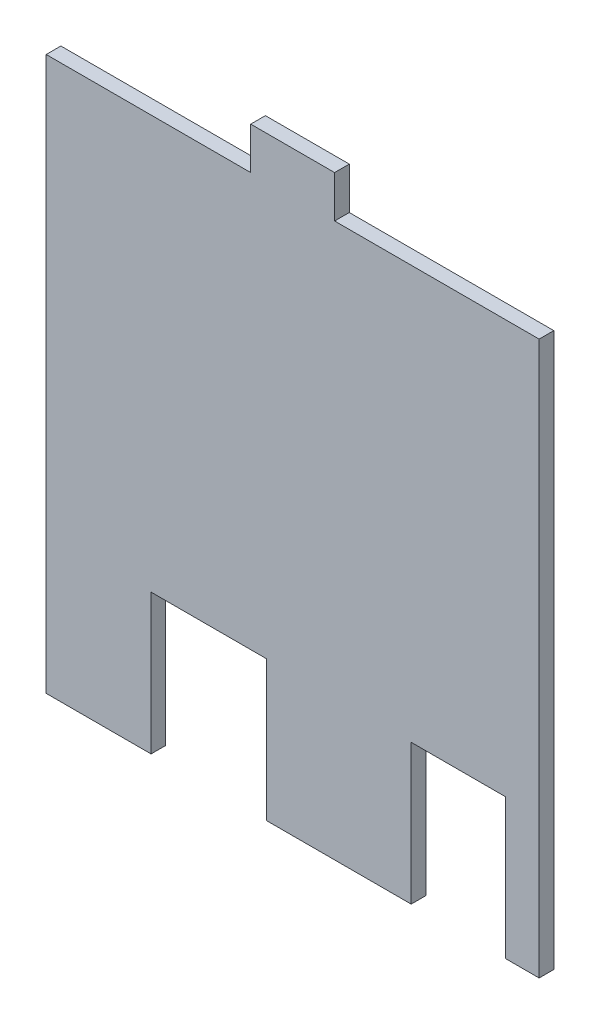
ISO-10303-21;
HEADER;
FILE_DESCRIPTION(('STEP AP214'),'2;1');
FILE_NAME('part.step','',(''),(''),'','','');
FILE_SCHEMA(('AUTOMOTIVE_DESIGN { 1 0 10303 214 1 1 1 1 }'));
ENDSEC;
DATA;
#1=APPLICATION_CONTEXT('core data for automotive mechanical design processes');
#2=APPLICATION_PROTOCOL_DEFINITION('international standard','automotive_design',2000,#1);
#3=PRODUCT_CONTEXT('',#1,'mechanical');
#4=PRODUCT('Part','Part','',(#3));
#5=PRODUCT_RELATED_PRODUCT_CATEGORY('part','',(#4));
#6=PRODUCT_DEFINITION_FORMATION('','',#4);
#7=PRODUCT_DEFINITION_CONTEXT('part definition',#1,'design');
#8=PRODUCT_DEFINITION('design','',#6,#7);
#9=PRODUCT_DEFINITION_SHAPE('','',#8);
#10=(LENGTH_UNIT() NAMED_UNIT(*) SI_UNIT(.MILLI.,.METRE.));
#11=(NAMED_UNIT(*) PLANE_ANGLE_UNIT() SI_UNIT($,.RADIAN.));
#12=(NAMED_UNIT(*) SI_UNIT($,.STERADIAN.) SOLID_ANGLE_UNIT());
#13=UNCERTAINTY_MEASURE_WITH_UNIT(LENGTH_MEASURE(1.E-05),#10,'distance_accuracy_value','');
#14=(GEOMETRIC_REPRESENTATION_CONTEXT(3) GLOBAL_UNCERTAINTY_ASSIGNED_CONTEXT((#13)) GLOBAL_UNIT_ASSIGNED_CONTEXT((#10,
#11,#12)) REPRESENTATION_CONTEXT('',''));
#15=CARTESIAN_POINT('',(0.,0.,0.));
#16=DIRECTION('',(0.,0.,1.));
#17=DIRECTION('',(1.,0.,0.));
#18=AXIS2_PLACEMENT_3D('',#15,#16,#17);
#19=CARTESIAN_POINT('',(29.845,-33.5,1.778));
#20=DIRECTION('',(-1.,0.,0.));
#21=DIRECTION('',(0.,0.,1.));
#22=AXIS2_PLACEMENT_3D('',#19,#20,#21);
#23=PLANE('',#22);
#24=DIRECTION('',(0.,1.,0.));
#25=VECTOR('',#24,1.);
#26=CARTESIAN_POINT('',(29.845,-33.5,0.));
#27=LINE('',#26,#25);
#28=CARTESIAN_POINT('',(29.845,-33.5,0.));
#29=VERTEX_POINT('',#28);
#30=CARTESIAN_POINT('',(29.845,33.5,0.));
#31=VERTEX_POINT('',#30);
#32=EDGE_CURVE('E178',#29,#31,#27,.T.);
#33=ORIENTED_EDGE('',*,*,#32,.T.);
#34=DIRECTION('',(0.,0.,-1.));
#35=VECTOR('',#34,1.);
#36=CARTESIAN_POINT('',(29.845,33.5,1.778));
#37=LINE('',#36,#35);
#38=CARTESIAN_POINT('',(29.845,33.5,1.778));
#39=VERTEX_POINT('',#38);
#40=EDGE_CURVE('E11',#39,#31,#37,.T.);
#41=ORIENTED_EDGE('',*,*,#40,.F.);
#42=DIRECTION('',(0.,1.,0.));
#43=VECTOR('',#42,1.);
#44=CARTESIAN_POINT('',(29.845,-33.5,1.778));
#45=LINE('',#44,#43);
#46=CARTESIAN_POINT('',(29.845,-33.5,1.778));
#47=VERTEX_POINT('',#46);
#48=EDGE_CURVE('E208',#47,#39,#45,.T.);
#49=ORIENTED_EDGE('',*,*,#48,.F.);
#50=DIRECTION('',(0.,0.,-1.));
#51=VECTOR('',#50,1.);
#52=CARTESIAN_POINT('',(29.845,-33.5,1.778));
#53=LINE('',#52,#51);
#54=EDGE_CURVE('E174',#47,#29,#53,.T.);
#55=ORIENTED_EDGE('',*,*,#54,.T.);
#56=EDGE_LOOP('',(#33,#41,#49,#55));
#57=FACE_BOUND('',#56,.T.);
#58=ADVANCED_FACE('F34',(#57),#23,.F.);
#59=CARTESIAN_POINT('',(5.08,33.5,1.778));
#60=DIRECTION('',(0.,-1.,0.));
#61=DIRECTION('',(0.,0.,-1.));
#62=AXIS2_PLACEMENT_3D('',#59,#60,#61);
#63=PLANE('',#62);
#64=DIRECTION('',(-1.,0.,0.));
#65=VECTOR('',#64,1.);
#66=CARTESIAN_POINT('',(5.08,33.5,0.));
#67=LINE('',#66,#65);
#68=CARTESIAN_POINT('',(5.08,33.5,0.));
#69=VERTEX_POINT('',#68);
#70=EDGE_CURVE('E181',#31,#69,#67,.T.);
#71=ORIENTED_EDGE('',*,*,#70,.T.);
#72=DIRECTION('',(0.,0.,-1.));
#73=VECTOR('',#72,1.);
#74=CARTESIAN_POINT('',(5.08,33.5,1.778));
#75=LINE('',#74,#73);
#76=CARTESIAN_POINT('',(5.08,33.5,1.778));
#77=VERTEX_POINT('',#76);
#78=EDGE_CURVE('E42',#77,#69,#75,.T.);
#79=ORIENTED_EDGE('',*,*,#78,.F.);
#80=DIRECTION('',(-1.,0.,0.));
#81=VECTOR('',#80,1.);
#82=CARTESIAN_POINT('',(5.08,33.5,1.778));
#83=LINE('',#82,#81);
#84=EDGE_CURVE('E117',#39,#77,#83,.T.);
#85=ORIENTED_EDGE('',*,*,#84,.F.);
#86=ORIENTED_EDGE('',*,*,#40,.T.);
#87=EDGE_LOOP('',(#71,#79,#85,#86));
#88=FACE_BOUND('',#87,.T.);
#89=ADVANCED_FACE('F306',(#88),#63,.F.);
#90=CARTESIAN_POINT('',(5.08,33.5,1.778));
#91=DIRECTION('',(-1.,0.,0.));
#92=DIRECTION('',(0.,0.,1.));
#93=AXIS2_PLACEMENT_3D('',#90,#91,#92);
#94=PLANE('',#93);
#95=DIRECTION('',(0.,1.,0.));
#96=VECTOR('',#95,1.);
#97=CARTESIAN_POINT('',(5.08,33.5,0.));
#98=LINE('',#97,#96);
#99=CARTESIAN_POINT('',(5.08,38.58,0.));
#100=VERTEX_POINT('',#99);
#101=EDGE_CURVE('E183',#69,#100,#98,.T.);
#102=ORIENTED_EDGE('',*,*,#101,.T.);
#103=DIRECTION('',(0.,0.,-1.));
#104=VECTOR('',#103,1.);
#105=CARTESIAN_POINT('',(5.08,38.58,1.778));
#106=LINE('',#105,#104);
#107=CARTESIAN_POINT('',(5.08,38.58,1.778));
#108=VERTEX_POINT('',#107);
#109=EDGE_CURVE('E239',#108,#100,#106,.T.);
#110=ORIENTED_EDGE('',*,*,#109,.F.);
#111=DIRECTION('',(0.,1.,0.));
#112=VECTOR('',#111,1.);
#113=CARTESIAN_POINT('',(5.08,33.5,1.778));
#114=LINE('',#113,#112);
#115=EDGE_CURVE('E247',#77,#108,#114,.T.);
#116=ORIENTED_EDGE('',*,*,#115,.F.);
#117=ORIENTED_EDGE('',*,*,#78,.T.);
#118=EDGE_LOOP('',(#102,#110,#116,#117));
#119=FACE_BOUND('',#118,.T.);
#120=ADVANCED_FACE('F245',(#119),#94,.F.);
#121=CARTESIAN_POINT('',(-5.08,38.58,1.778));
#122=DIRECTION('',(0.,-1.,0.));
#123=DIRECTION('',(0.,0.,-1.));
#124=AXIS2_PLACEMENT_3D('',#121,#122,#123);
#125=PLANE('',#124);
#126=DIRECTION('',(-1.,0.,0.));
#127=VECTOR('',#126,1.);
#128=CARTESIAN_POINT('',(-5.08,38.58,0.));
#129=LINE('',#128,#127);
#130=CARTESIAN_POINT('',(-5.08,38.58,0.));
#131=VERTEX_POINT('',#130);
#132=EDGE_CURVE('E185',#100,#131,#129,.T.);
#133=ORIENTED_EDGE('',*,*,#132,.T.);
#134=DIRECTION('',(0.,0.,-1.));
#135=VECTOR('',#134,1.);
#136=CARTESIAN_POINT('',(-5.08,38.58,1.778));
#137=LINE('',#136,#135);
#138=CARTESIAN_POINT('',(-5.08,38.58,1.778));
#139=VERTEX_POINT('',#138);
#140=EDGE_CURVE('E236',#139,#131,#137,.T.);
#141=ORIENTED_EDGE('',*,*,#140,.F.);
#142=DIRECTION('',(-1.,0.,0.));
#143=VECTOR('',#142,1.);
#144=CARTESIAN_POINT('',(-5.08,38.58,1.778));
#145=LINE('',#144,#143);
#146=EDGE_CURVE('E265',#108,#139,#145,.T.);
#147=ORIENTED_EDGE('',*,*,#146,.F.);
#148=ORIENTED_EDGE('',*,*,#109,.T.);
#149=EDGE_LOOP('',(#133,#141,#147,#148));
#150=FACE_BOUND('',#149,.T.);
#151=ADVANCED_FACE('F256',(#150),#125,.F.);
#152=CARTESIAN_POINT('',(-5.08,33.5,1.778));
#153=DIRECTION('',(1.,0.,0.));
#154=DIRECTION('',(0.,1.,0.));
#155=AXIS2_PLACEMENT_3D('',#152,#153,#154);
#156=PLANE('',#155);
#157=DIRECTION('',(0.,-1.,0.));
#158=VECTOR('',#157,1.);
#159=CARTESIAN_POINT('',(-5.08,33.5,0.));
#160=LINE('',#159,#158);
#161=CARTESIAN_POINT('',(-5.08,33.5,0.));
#162=VERTEX_POINT('',#161);
#163=EDGE_CURVE('E187',#131,#162,#160,.T.);
#164=ORIENTED_EDGE('',*,*,#163,.T.);
#165=DIRECTION('',(0.,0.,-1.));
#166=VECTOR('',#165,1.);
#167=CARTESIAN_POINT('',(-5.08,33.5,1.778));
#168=LINE('',#167,#166);
#169=CARTESIAN_POINT('',(-5.08,33.5,1.778));
#170=VERTEX_POINT('',#169);
#171=EDGE_CURVE('E233',#170,#162,#168,.T.);
#172=ORIENTED_EDGE('',*,*,#171,.F.);
#173=DIRECTION('',(0.,-1.,0.));
#174=VECTOR('',#173,1.);
#175=CARTESIAN_POINT('',(-5.08,33.5,1.778));
#176=LINE('',#175,#174);
#177=EDGE_CURVE('E262',#139,#170,#176,.T.);
#178=ORIENTED_EDGE('',*,*,#177,.F.);
#179=ORIENTED_EDGE('',*,*,#140,.T.);
#180=EDGE_LOOP('',(#164,#172,#178,#179));
#181=FACE_BOUND('',#180,.T.);
#182=ADVANCED_FACE('F260',(#181),#156,.F.);
#183=CARTESIAN_POINT('',(-29.845,33.5,1.778));
#184=DIRECTION('',(0.,-1.,0.));
#185=DIRECTION('',(0.,0.,-1.));
#186=AXIS2_PLACEMENT_3D('',#183,#184,#185);
#187=PLANE('',#186);
#188=DIRECTION('',(-1.,0.,0.));
#189=VECTOR('',#188,1.);
#190=CARTESIAN_POINT('',(-29.845,33.5,0.));
#191=LINE('',#190,#189);
#192=CARTESIAN_POINT('',(-29.845,33.5,0.));
#193=VERTEX_POINT('',#192);
#194=EDGE_CURVE('E189',#162,#193,#191,.T.);
#195=ORIENTED_EDGE('',*,*,#194,.T.);
#196=DIRECTION('',(0.,0.,-1.));
#197=VECTOR('',#196,1.);
#198=CARTESIAN_POINT('',(-29.845,33.5,1.778));
#199=LINE('',#198,#197);
#200=CARTESIAN_POINT('',(-29.845,33.5,1.778));
#201=VERTEX_POINT('',#200);
#202=EDGE_CURVE('E230',#201,#193,#199,.T.);
#203=ORIENTED_EDGE('',*,*,#202,.F.);
#204=DIRECTION('',(-1.,0.,0.));
#205=VECTOR('',#204,1.);
#206=CARTESIAN_POINT('',(-29.845,33.5,1.778));
#207=LINE('',#206,#205);
#208=EDGE_CURVE('E264',#170,#201,#207,.T.);
#209=ORIENTED_EDGE('',*,*,#208,.F.);
#210=ORIENTED_EDGE('',*,*,#171,.T.);
#211=EDGE_LOOP('',(#195,#203,#209,#210));
#212=FACE_BOUND('',#211,.T.);
#213=ADVANCED_FACE('F319',(#212),#187,.F.);
#214=CARTESIAN_POINT('',(-29.845,-33.5,1.778));
#215=DIRECTION('',(1.,0.,0.));
#216=DIRECTION('',(0.,0.,-1.));
#217=AXIS2_PLACEMENT_3D('',#214,#215,#216);
#218=PLANE('',#217);
#219=DIRECTION('',(0.,-1.,0.));
#220=VECTOR('',#219,1.);
#221=CARTESIAN_POINT('',(-29.845,-33.5,0.));
#222=LINE('',#221,#220);
#223=CARTESIAN_POINT('',(-29.845,-33.5,0.));
#224=VERTEX_POINT('',#223);
#225=EDGE_CURVE('E191',#193,#224,#222,.T.);
#226=ORIENTED_EDGE('',*,*,#225,.T.);
#227=DIRECTION('',(0.,0.,-1.));
#228=VECTOR('',#227,1.);
#229=CARTESIAN_POINT('',(-29.845,-33.5,1.778));
#230=LINE('',#229,#228);
#231=CARTESIAN_POINT('',(-29.845,-33.5,1.778));
#232=VERTEX_POINT('',#231);
#233=EDGE_CURVE('E227',#232,#224,#230,.T.);
#234=ORIENTED_EDGE('',*,*,#233,.F.);
#235=DIRECTION('',(0.,-1.,0.));
#236=VECTOR('',#235,1.);
#237=CARTESIAN_POINT('',(-29.845,-33.5,1.778));
#238=LINE('',#237,#236);
#239=EDGE_CURVE('E267',#201,#232,#238,.T.);
#240=ORIENTED_EDGE('',*,*,#239,.F.);
#241=ORIENTED_EDGE('',*,*,#202,.T.);
#242=EDGE_LOOP('',(#226,#234,#240,#241));
#243=FACE_BOUND('',#242,.T.);
#244=ADVANCED_FACE('F322',(#243),#218,.F.);
#245=CARTESIAN_POINT('',(-29.845,-33.5,1.778));
#246=DIRECTION('',(0.,1.,0.));
#247=DIRECTION('',(0.,0.,1.));
#248=AXIS2_PLACEMENT_3D('',#245,#246,#247);
#249=PLANE('',#248);
#250=DIRECTION('',(1.,0.,0.));
#251=VECTOR('',#250,1.);
#252=CARTESIAN_POINT('',(-29.845,-33.5,0.));
#253=LINE('',#252,#251);
#254=CARTESIAN_POINT('',(-17.145,-33.5,0.));
#255=VERTEX_POINT('',#254);
#256=EDGE_CURVE('E193',#224,#255,#253,.T.);
#257=ORIENTED_EDGE('',*,*,#256,.T.);
#258=DIRECTION('',(0.,0.,-1.));
#259=VECTOR('',#258,1.);
#260=CARTESIAN_POINT('',(-17.145,-33.5,1.778));
#261=LINE('',#260,#259);
#262=CARTESIAN_POINT('',(-17.145,-33.5,1.778));
#263=VERTEX_POINT('',#262);
#264=EDGE_CURVE('E224',#263,#255,#261,.T.);
#265=ORIENTED_EDGE('',*,*,#264,.F.);
#266=DIRECTION('',(1.,0.,0.));
#267=VECTOR('',#266,1.);
#268=CARTESIAN_POINT('',(-29.845,-33.5,1.778));
#269=LINE('',#268,#267);
#270=EDGE_CURVE('E273',#232,#263,#269,.T.);
#271=ORIENTED_EDGE('',*,*,#270,.F.);
#272=ORIENTED_EDGE('',*,*,#233,.T.);
#273=EDGE_LOOP('',(#257,#265,#271,#272));
#274=FACE_BOUND('',#273,.T.);
#275=ADVANCED_FACE('F326',(#274),#249,.F.);
#276=CARTESIAN_POINT('',(-17.145,-16.529999904,1.778));
#277=DIRECTION('',(-1.,0.,0.));
#278=DIRECTION('',(0.,0.,1.));
#279=AXIS2_PLACEMENT_3D('',#276,#277,#278);
#280=PLANE('',#279);
#281=DIRECTION('',(0.,1.,0.));
#282=VECTOR('',#281,1.);
#283=CARTESIAN_POINT('',(-17.145,-16.529999904,0.));
#284=LINE('',#283,#282);
#285=CARTESIAN_POINT('',(-17.145,-16.529999904,0.));
#286=VERTEX_POINT('',#285);
#287=EDGE_CURVE('E195',#255,#286,#284,.T.);
#288=ORIENTED_EDGE('',*,*,#287,.T.);
#289=DIRECTION('',(0.,0.,-1.));
#290=VECTOR('',#289,1.);
#291=CARTESIAN_POINT('',(-17.145,-16.529999904,1.778));
#292=LINE('',#291,#290);
#293=CARTESIAN_POINT('',(-17.145,-16.529999904,1.778));
#294=VERTEX_POINT('',#293);
#295=EDGE_CURVE('E221',#294,#286,#292,.T.);
#296=ORIENTED_EDGE('',*,*,#295,.F.);
#297=DIRECTION('',(0.,1.,0.));
#298=VECTOR('',#297,1.);
#299=CARTESIAN_POINT('',(-17.145,-16.529999904,1.778));
#300=LINE('',#299,#298);
#301=EDGE_CURVE('E275',#263,#294,#300,.T.);
#302=ORIENTED_EDGE('',*,*,#301,.F.);
#303=ORIENTED_EDGE('',*,*,#264,.T.);
#304=EDGE_LOOP('',(#288,#296,#302,#303));
#305=FACE_BOUND('',#304,.T.);
#306=ADVANCED_FACE('F330',(#305),#280,.F.);
#307=CARTESIAN_POINT('',(-17.145,-16.529999904,1.778));
#308=DIRECTION('',(0.,1.,0.));
#309=DIRECTION('',(-1.,0.,0.));
#310=AXIS2_PLACEMENT_3D('',#307,#308,#309);
#311=PLANE('',#310);
#312=DIRECTION('',(1.,0.,0.));
#313=VECTOR('',#312,1.);
#314=CARTESIAN_POINT('',(-17.145,-16.529999904,0.));
#315=LINE('',#314,#313);
#316=CARTESIAN_POINT('',(-3.175,-16.529999904,0.));
#317=VERTEX_POINT('',#316);
#318=EDGE_CURVE('E197',#286,#317,#315,.T.);
#319=ORIENTED_EDGE('',*,*,#318,.T.);
#320=DIRECTION('',(0.,0.,-1.));
#321=VECTOR('',#320,1.);
#322=CARTESIAN_POINT('',(-3.175,-16.529999904,1.778));
#323=LINE('',#322,#321);
#324=CARTESIAN_POINT('',(-3.175,-16.529999904,1.778));
#325=VERTEX_POINT('',#324);
#326=EDGE_CURVE('E218',#325,#317,#323,.T.);
#327=ORIENTED_EDGE('',*,*,#326,.F.);
#328=DIRECTION('',(1.,0.,0.));
#329=VECTOR('',#328,1.);
#330=CARTESIAN_POINT('',(-17.145,-16.529999904,1.778));
#331=LINE('',#330,#329);
#332=EDGE_CURVE('E277',#294,#325,#331,.T.);
#333=ORIENTED_EDGE('',*,*,#332,.F.);
#334=ORIENTED_EDGE('',*,*,#295,.T.);
#335=EDGE_LOOP('',(#319,#327,#333,#334));
#336=FACE_BOUND('',#335,.T.);
#337=ADVANCED_FACE('F334',(#336),#311,.F.);
#338=CARTESIAN_POINT('',(-3.175,-16.529999904,1.778));
#339=DIRECTION('',(1.,0.,0.));
#340=DIRECTION('',(0.,1.,0.));
#341=AXIS2_PLACEMENT_3D('',#338,#339,#340);
#342=PLANE('',#341);
#343=DIRECTION('',(0.,-1.,0.));
#344=VECTOR('',#343,1.);
#345=CARTESIAN_POINT('',(-3.175,-16.529999904,0.));
#346=LINE('',#345,#344);
#347=CARTESIAN_POINT('',(-3.175,-33.5,0.));
#348=VERTEX_POINT('',#347);
#349=EDGE_CURVE('E199',#317,#348,#346,.T.);
#350=ORIENTED_EDGE('',*,*,#349,.T.);
#351=DIRECTION('',(0.,0.,-1.));
#352=VECTOR('',#351,1.);
#353=CARTESIAN_POINT('',(-3.175,-33.5,1.778));
#354=LINE('',#353,#352);
#355=CARTESIAN_POINT('',(-3.175,-33.5,1.778));
#356=VERTEX_POINT('',#355);
#357=EDGE_CURVE('E215',#356,#348,#354,.T.);
#358=ORIENTED_EDGE('',*,*,#357,.F.);
#359=DIRECTION('',(0.,-1.,0.));
#360=VECTOR('',#359,1.);
#361=CARTESIAN_POINT('',(-3.175,-16.529999904,1.778));
#362=LINE('',#361,#360);
#363=EDGE_CURVE('E279',#325,#356,#362,.T.);
#364=ORIENTED_EDGE('',*,*,#363,.F.);
#365=ORIENTED_EDGE('',*,*,#326,.T.);
#366=EDGE_LOOP('',(#350,#358,#364,#365));
#367=FACE_BOUND('',#366,.T.);
#368=ADVANCED_FACE('F338',(#367),#342,.F.);
#369=CARTESIAN_POINT('',(-3.175,-33.5,1.778));
#370=DIRECTION('',(0.,1.,0.));
#371=DIRECTION('',(0.,0.,1.));
#372=AXIS2_PLACEMENT_3D('',#369,#370,#371);
#373=PLANE('',#372);
#374=DIRECTION('',(1.,0.,0.));
#375=VECTOR('',#374,1.);
#376=CARTESIAN_POINT('',(-3.175,-33.5,0.));
#377=LINE('',#376,#375);
#378=CARTESIAN_POINT('',(14.351,-33.5,0.));
#379=VERTEX_POINT('',#378);
#380=EDGE_CURVE('E201',#348,#379,#377,.T.);
#381=ORIENTED_EDGE('',*,*,#380,.T.);
#382=DIRECTION('',(0.,0.,-1.));
#383=VECTOR('',#382,1.);
#384=CARTESIAN_POINT('',(14.351,-33.5,1.778));
#385=LINE('',#384,#383);
#386=CARTESIAN_POINT('',(14.351,-33.5,1.778));
#387=VERTEX_POINT('',#386);
#388=EDGE_CURVE('E212',#387,#379,#385,.T.);
#389=ORIENTED_EDGE('',*,*,#388,.F.);
#390=DIRECTION('',(1.,0.,0.));
#391=VECTOR('',#390,1.);
#392=CARTESIAN_POINT('',(-3.175,-33.5,1.778));
#393=LINE('',#392,#391);
#394=EDGE_CURVE('E281',#356,#387,#393,.T.);
#395=ORIENTED_EDGE('',*,*,#394,.F.);
#396=ORIENTED_EDGE('',*,*,#357,.T.);
#397=EDGE_LOOP('',(#381,#389,#395,#396));
#398=FACE_BOUND('',#397,.T.);
#399=ADVANCED_FACE('F287',(#398),#373,.F.);
#400=CARTESIAN_POINT('',(14.351,-16.529999904,1.778));
#401=DIRECTION('',(-1.,0.,0.));
#402=DIRECTION('',(0.,-1.,0.));
#403=AXIS2_PLACEMENT_3D('',#400,#401,#402);
#404=PLANE('',#403);
#405=DIRECTION('',(0.,1.,0.));
#406=VECTOR('',#405,1.);
#407=CARTESIAN_POINT('',(14.351,-16.529999904,0.));
#408=LINE('',#407,#406);
#409=CARTESIAN_POINT('',(14.351,-16.529999904,0.));
#410=VERTEX_POINT('',#409);
#411=EDGE_CURVE('E203',#379,#410,#408,.T.);
#412=ORIENTED_EDGE('',*,*,#411,.T.);
#413=DIRECTION('',(0.,0.,-1.));
#414=VECTOR('',#413,1.);
#415=CARTESIAN_POINT('',(14.351,-16.529999904,1.778));
#416=LINE('',#415,#414);
#417=CARTESIAN_POINT('',(14.351,-16.529999904,1.778));
#418=VERTEX_POINT('',#417);
#419=EDGE_CURVE('E169',#418,#410,#416,.T.);
#420=ORIENTED_EDGE('',*,*,#419,.F.);
#421=DIRECTION('',(0.,1.,0.));
#422=VECTOR('',#421,1.);
#423=CARTESIAN_POINT('',(14.351,-16.529999904,1.778));
#424=LINE('',#423,#422);
#425=EDGE_CURVE('E160',#387,#418,#424,.T.);
#426=ORIENTED_EDGE('',*,*,#425,.F.);
#427=ORIENTED_EDGE('',*,*,#388,.T.);
#428=EDGE_LOOP('',(#412,#420,#426,#427));
#429=FACE_BOUND('',#428,.T.);
#430=ADVANCED_FACE('F291',(#429),#404,.F.);
#431=CARTESIAN_POINT('',(14.351,-16.529999904,1.778));
#432=DIRECTION('',(0.,1.,0.));
#433=DIRECTION('',(0.,0.,1.));
#434=AXIS2_PLACEMENT_3D('',#431,#432,#433);
#435=PLANE('',#434);
#436=DIRECTION('',(1.,0.,0.));
#437=VECTOR('',#436,1.);
#438=CARTESIAN_POINT('',(14.351,-16.529999904,0.));
#439=LINE('',#438,#437);
#440=CARTESIAN_POINT('',(25.781,-16.529999904,0.));
#441=VERTEX_POINT('',#440);
#442=EDGE_CURVE('E168',#410,#441,#439,.T.);
#443=ORIENTED_EDGE('',*,*,#442,.T.);
#444=DIRECTION('',(0.,0.,-1.));
#445=VECTOR('',#444,1.);
#446=CARTESIAN_POINT('',(25.781,-16.529999904,1.778));
#447=LINE('',#446,#445);
#448=CARTESIAN_POINT('',(25.781,-16.529999904,1.778));
#449=VERTEX_POINT('',#448);
#450=EDGE_CURVE('E165',#449,#441,#447,.T.);
#451=ORIENTED_EDGE('',*,*,#450,.F.);
#452=DIRECTION('',(1.,0.,0.));
#453=VECTOR('',#452,1.);
#454=CARTESIAN_POINT('',(14.351,-16.529999904,1.778));
#455=LINE('',#454,#453);
#456=EDGE_CURVE('E154',#418,#449,#455,.T.);
#457=ORIENTED_EDGE('',*,*,#456,.F.);
#458=ORIENTED_EDGE('',*,*,#419,.T.);
#459=EDGE_LOOP('',(#443,#451,#457,#458));
#460=FACE_BOUND('',#459,.T.);
#461=ADVANCED_FACE('F166',(#460),#435,.F.);
#462=CARTESIAN_POINT('',(25.781,-16.529999904,1.778));
#463=DIRECTION('',(1.,0.,0.));
#464=DIRECTION('',(0.,1.,0.));
#465=AXIS2_PLACEMENT_3D('',#462,#463,#464);
#466=PLANE('',#465);
#467=DIRECTION('',(0.,-1.,0.));
#468=VECTOR('',#467,1.);
#469=CARTESIAN_POINT('',(25.781,-16.529999904,0.));
#470=LINE('',#469,#468);
#471=CARTESIAN_POINT('',(25.781,-33.5,0.));
#472=VERTEX_POINT('',#471);
#473=EDGE_CURVE('E103',#441,#472,#470,.T.);
#474=ORIENTED_EDGE('',*,*,#473,.T.);
#475=DIRECTION('',(0.,0.,-1.));
#476=VECTOR('',#475,1.);
#477=CARTESIAN_POINT('',(25.781,-33.5,1.778));
#478=LINE('',#477,#476);
#479=CARTESIAN_POINT('',(25.781,-33.5,1.778));
#480=VERTEX_POINT('',#479);
#481=EDGE_CURVE('E170',#480,#472,#478,.T.);
#482=ORIENTED_EDGE('',*,*,#481,.F.);
#483=DIRECTION('',(0.,-1.,0.));
#484=VECTOR('',#483,1.);
#485=CARTESIAN_POINT('',(25.781,-16.529999904,1.778));
#486=LINE('',#485,#484);
#487=EDGE_CURVE('E158',#449,#480,#486,.T.);
#488=ORIENTED_EDGE('',*,*,#487,.F.);
#489=ORIENTED_EDGE('',*,*,#450,.T.);
#490=EDGE_LOOP('',(#474,#482,#488,#489));
#491=FACE_BOUND('',#490,.T.);
#492=ADVANCED_FACE('F172',(#491),#466,.F.);
#493=CARTESIAN_POINT('',(25.781,-33.5,1.778));
#494=DIRECTION('',(0.,1.,0.));
#495=DIRECTION('',(0.,0.,1.));
#496=AXIS2_PLACEMENT_3D('',#493,#494,#495);
#497=PLANE('',#496);
#498=DIRECTION('',(1.,0.,0.));
#499=VECTOR('',#498,1.);
#500=CARTESIAN_POINT('',(25.781,-33.5,0.));
#501=LINE('',#500,#499);
#502=EDGE_CURVE('E109',#472,#29,#501,.T.);
#503=ORIENTED_EDGE('',*,*,#502,.T.);
#504=ORIENTED_EDGE('',*,*,#54,.F.);
#505=DIRECTION('',(1.,0.,0.));
#506=VECTOR('',#505,1.);
#507=CARTESIAN_POINT('',(25.781,-33.5,1.778));
#508=LINE('',#507,#506);
#509=EDGE_CURVE('E50',#480,#47,#508,.T.);
#510=ORIENTED_EDGE('',*,*,#509,.F.);
#511=ORIENTED_EDGE('',*,*,#481,.T.);
#512=EDGE_LOOP('',(#503,#504,#510,#511));
#513=FACE_BOUND('',#512,.T.);
#514=ADVANCED_FACE('F295',(#513),#497,.F.);
#515=CARTESIAN_POINT('',(0.,0.,1.778));
#516=DIRECTION('',(0.,0.,-1.));
#517=DIRECTION('',(-1.,0.,0.));
#518=AXIS2_PLACEMENT_3D('',#515,#516,#517);
#519=PLANE('',#518);
#520=ORIENTED_EDGE('',*,*,#48,.T.);
#521=ORIENTED_EDGE('',*,*,#84,.T.);
#522=ORIENTED_EDGE('',*,*,#115,.T.);
#523=ORIENTED_EDGE('',*,*,#146,.T.);
#524=ORIENTED_EDGE('',*,*,#177,.T.);
#525=ORIENTED_EDGE('',*,*,#208,.T.);
#526=ORIENTED_EDGE('',*,*,#239,.T.);
#527=ORIENTED_EDGE('',*,*,#270,.T.);
#528=ORIENTED_EDGE('',*,*,#301,.T.);
#529=ORIENTED_EDGE('',*,*,#332,.T.);
#530=ORIENTED_EDGE('',*,*,#363,.T.);
#531=ORIENTED_EDGE('',*,*,#394,.T.);
#532=ORIENTED_EDGE('',*,*,#425,.T.);
#533=ORIENTED_EDGE('',*,*,#456,.T.);
#534=ORIENTED_EDGE('',*,*,#487,.T.);
#535=ORIENTED_EDGE('',*,*,#509,.T.);
#536=EDGE_LOOP('',(#520,#521,#522,#523,#524,#525,#526,#527,#528,#529,#530,#531,#532,#533,#534,#535));
#537=FACE_BOUND('',#536,.T.);
#538=ADVANCED_FACE('F156',(#537),#519,.F.);
#539=CARTESIAN_POINT('',(0.,0.,0.));
#540=DIRECTION('',(0.,0.,-1.));
#541=DIRECTION('',(-1.,0.,0.));
#542=AXIS2_PLACEMENT_3D('',#539,#540,#541);
#543=PLANE('',#542);
#544=ORIENTED_EDGE('',*,*,#32,.F.);
#545=ORIENTED_EDGE('',*,*,#502,.F.);
#546=ORIENTED_EDGE('',*,*,#473,.F.);
#547=ORIENTED_EDGE('',*,*,#442,.F.);
#548=ORIENTED_EDGE('',*,*,#411,.F.);
#549=ORIENTED_EDGE('',*,*,#380,.F.);
#550=ORIENTED_EDGE('',*,*,#349,.F.);
#551=ORIENTED_EDGE('',*,*,#318,.F.);
#552=ORIENTED_EDGE('',*,*,#287,.F.);
#553=ORIENTED_EDGE('',*,*,#256,.F.);
#554=ORIENTED_EDGE('',*,*,#225,.F.);
#555=ORIENTED_EDGE('',*,*,#194,.F.);
#556=ORIENTED_EDGE('',*,*,#163,.F.);
#557=ORIENTED_EDGE('',*,*,#132,.F.);
#558=ORIENTED_EDGE('',*,*,#101,.F.);
#559=ORIENTED_EDGE('',*,*,#70,.F.);
#560=EDGE_LOOP('',(#544,#545,#546,#547,#548,#549,#550,#551,#552,#553,#554,#555,#556,#557,#558,#559));
#561=FACE_BOUND('',#560,.T.);
#562=ADVANCED_FACE('F251',(#561),#543,.T.);
#563=CLOSED_SHELL('',(#58,#89,#120,#151,#182,#213,#244,#275,#306,#337,#368,#399,#430,#461,#492,
#514,#538,#562));
#564=MANIFOLD_SOLID_BREP('B2',#563);
#565=ADVANCED_BREP_SHAPE_REPRESENTATION('',(#18,#564),#14);
#566=SHAPE_DEFINITION_REPRESENTATION(#9,#565);
ENDSEC;
END-ISO-10303-21;
